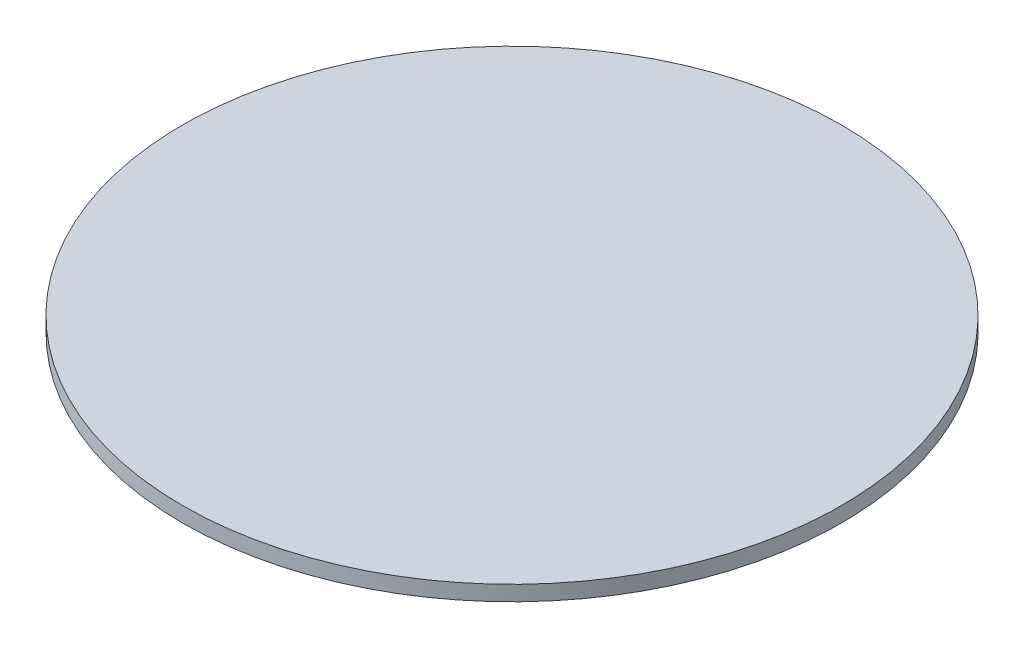
ISO-10303-21;
HEADER;
FILE_DESCRIPTION(('STEP AP214'),'2;1');
FILE_NAME('part.step','',(''),(''),'','','');
FILE_SCHEMA(('AUTOMOTIVE_DESIGN { 1 0 10303 214 1 1 1 1 }'));
ENDSEC;
DATA;
#1=APPLICATION_CONTEXT('core data for automotive mechanical design processes');
#2=APPLICATION_PROTOCOL_DEFINITION('international standard','automotive_design',2000,#1);
#3=PRODUCT_CONTEXT('',#1,'mechanical');
#4=PRODUCT('Part','Part','',(#3));
#5=PRODUCT_RELATED_PRODUCT_CATEGORY('part','',(#4));
#6=PRODUCT_DEFINITION_FORMATION('','',#4);
#7=PRODUCT_DEFINITION_CONTEXT('part definition',#1,'design');
#8=PRODUCT_DEFINITION('design','',#6,#7);
#9=PRODUCT_DEFINITION_SHAPE('','',#8);
#10=(LENGTH_UNIT() NAMED_UNIT(*) SI_UNIT(.MILLI.,.METRE.));
#11=(NAMED_UNIT(*) PLANE_ANGLE_UNIT() SI_UNIT($,.RADIAN.));
#12=(NAMED_UNIT(*) SI_UNIT($,.STERADIAN.) SOLID_ANGLE_UNIT());
#13=UNCERTAINTY_MEASURE_WITH_UNIT(LENGTH_MEASURE(1.E-05),#10,'distance_accuracy_value','');
#14=(GEOMETRIC_REPRESENTATION_CONTEXT(3) GLOBAL_UNCERTAINTY_ASSIGNED_CONTEXT((#13)) GLOBAL_UNIT_ASSIGNED_CONTEXT((#10,
#11,#12)) REPRESENTATION_CONTEXT('',''));
#15=CARTESIAN_POINT('',(0.,0.,0.));
#16=DIRECTION('',(0.,0.,1.));
#17=DIRECTION('',(1.,0.,0.));
#18=AXIS2_PLACEMENT_3D('',#15,#16,#17);
#19=CARTESIAN_POINT('',(0.,-2.3,0.));
#20=DIRECTION('',(0.,1.,0.));
#21=DIRECTION('',(0.,0.,1.));
#22=AXIS2_PLACEMENT_3D('',#19,#20,#21);
#23=CYLINDRICAL_SURFACE('',#22,50.);
#24=CARTESIAN_POINT('',(0.,-2.3,0.));
#25=DIRECTION('',(0.,1.,0.));
#26=DIRECTION('',(0.,0.,1.));
#27=AXIS2_PLACEMENT_3D('',#24,#25,#26);
#28=CIRCLE('',#27,50.);
#29=CARTESIAN_POINT('',(0.,-2.3,50.));
#30=VERTEX_POINT('',#29);
#31=EDGE_CURVE('E11',#30,#30,#28,.T.);
#32=ORIENTED_EDGE('',*,*,#31,.T.);
#33=EDGE_LOOP('',(#32));
#34=FACE_BOUND('',#33,.T.);
#35=CARTESIAN_POINT('',(0.,0.,0.));
#36=DIRECTION('',(0.,1.,0.));
#37=DIRECTION('',(0.,0.,1.));
#38=AXIS2_PLACEMENT_3D('',#35,#36,#37);
#39=CIRCLE('',#38,50.);
#40=CARTESIAN_POINT('',(0.,0.,50.));
#41=VERTEX_POINT('',#40);
#42=EDGE_CURVE('E49',#41,#41,#39,.T.);
#43=ORIENTED_EDGE('',*,*,#42,.F.);
#44=EDGE_LOOP('',(#43));
#45=FACE_BOUND('',#44,.T.);
#46=ADVANCED_FACE('F46',(#34,#45),#23,.T.);
#47=CARTESIAN_POINT('',(0.,-2.3,0.));
#48=DIRECTION('',(0.,1.,0.));
#49=DIRECTION('',(0.,0.,1.));
#50=AXIS2_PLACEMENT_3D('',#47,#48,#49);
#51=PLANE('',#50);
#52=ORIENTED_EDGE('',*,*,#31,.F.);
#53=EDGE_LOOP('',(#52));
#54=FACE_BOUND('',#53,.T.);
#55=ADVANCED_FACE('F61',(#54),#51,.F.);
#56=CARTESIAN_POINT('',(0.,0.,0.));
#57=DIRECTION('',(0.,1.,0.));
#58=DIRECTION('',(0.,0.,1.));
#59=AXIS2_PLACEMENT_3D('',#56,#57,#58);
#60=PLANE('',#59);
#61=ORIENTED_EDGE('',*,*,#42,.T.);
#62=EDGE_LOOP('',(#61));
#63=FACE_BOUND('',#62,.T.);
#64=ADVANCED_FACE('F58',(#63),#60,.T.);
#65=CLOSED_SHELL('',(#46,#55,#64));
#66=MANIFOLD_SOLID_BREP('B2',#65);
#67=CARTESIAN_POINT('',(16.0143097169968,-2.3,-23.6911711029544));
#68=DIRECTION('',(0.,1.,0.));
#69=DIRECTION('',(0.,0.,1.));
#70=AXIS2_PLACEMENT_3D('',#67,#68,#69);
#71=CYLINDRICAL_SURFACE('',#70,12.5);
#72=CARTESIAN_POINT('',(16.0143097169968,-2.3,-23.6911711029544));
#73=DIRECTION('',(0.,1.,0.));
#74=DIRECTION('',(0.,0.,1.));
#75=AXIS2_PLACEMENT_3D('',#72,#73,#74);
#76=CIRCLE('',#75,12.5);
#77=CARTESIAN_POINT('',(16.0143097169968,-2.3,-11.1911711029544));
#78=VERTEX_POINT('',#77);
#79=EDGE_CURVE('E45',#78,#78,#76,.T.);
#80=ORIENTED_EDGE('',*,*,#79,.T.);
#81=EDGE_LOOP('',(#80));
#82=FACE_BOUND('',#81,.T.);
#83=CARTESIAN_POINT('',(16.0143097169968,0.,-23.6911711029544));
#84=DIRECTION('',(0.,1.,0.));
#85=DIRECTION('',(0.,0.,1.));
#86=AXIS2_PLACEMENT_3D('',#83,#84,#85);
#87=CIRCLE('',#86,12.5);
#88=CARTESIAN_POINT('',(16.0143097169968,0.,-11.1911711029544));
#89=VERTEX_POINT('',#88);
#90=EDGE_CURVE('E105',#89,#89,#87,.T.);
#91=ORIENTED_EDGE('',*,*,#90,.F.);
#92=EDGE_LOOP('',(#91));
#93=FACE_BOUND('',#92,.T.);
#94=ADVANCED_FACE('F102',(#82,#93),#71,.T.);
#95=CARTESIAN_POINT('',(16.0143097169968,-2.3,-23.6911711029544));
#96=DIRECTION('',(0.,1.,0.));
#97=DIRECTION('',(0.,0.,1.));
#98=AXIS2_PLACEMENT_3D('',#95,#96,#97);
#99=PLANE('',#98);
#100=CARTESIAN_POINT('',(16.0143097169968,-2.3,-23.6911711029544));
#101=DIRECTION('',(0.,1.,0.));
#102=DIRECTION('',(0.,0.,1.));
#103=AXIS2_PLACEMENT_3D('',#100,#101,#102);
#104=CIRCLE('',#103,1.5);
#105=CARTESIAN_POINT('',(16.0143097169968,-2.3,-22.1911711029544));
#106=VERTEX_POINT('',#105);
#107=EDGE_CURVE('E112',#106,#106,#104,.T.);
#108=ORIENTED_EDGE('',*,*,#107,.T.);
#109=EDGE_LOOP('',(#108));
#110=FACE_BOUND('',#109,.T.);
#111=ORIENTED_EDGE('',*,*,#79,.F.);
#112=EDGE_LOOP('',(#111));
#113=FACE_BOUND('',#112,.T.);
#114=ADVANCED_FACE('F120',(#110,#113),#99,.F.);
#115=CARTESIAN_POINT('',(16.0143097169968,0.,-23.6911711029544));
#116=DIRECTION('',(0.,1.,0.));
#117=DIRECTION('',(0.,0.,1.));
#118=AXIS2_PLACEMENT_3D('',#115,#116,#117);
#119=PLANE('',#118);
#120=CARTESIAN_POINT('',(16.0143097169968,0.,-23.6911711029544));
#121=DIRECTION('',(0.,1.,0.));
#122=DIRECTION('',(0.,0.,1.));
#123=AXIS2_PLACEMENT_3D('',#120,#121,#122);
#124=CIRCLE('',#123,1.5);
#125=CARTESIAN_POINT('',(16.0143097169968,0.,-22.1911711029544));
#126=VERTEX_POINT('',#125);
#127=EDGE_CURVE('E114',#126,#126,#124,.T.);
#128=ORIENTED_EDGE('',*,*,#127,.F.);
#129=EDGE_LOOP('',(#128));
#130=FACE_BOUND('',#129,.T.);
#131=ORIENTED_EDGE('',*,*,#90,.T.);
#132=EDGE_LOOP('',(#131));
#133=FACE_BOUND('',#132,.T.);
#134=ADVANCED_FACE('F126',(#130,#133),#119,.T.);
#135=CARTESIAN_POINT('',(16.0143097169968,-2.3,-23.6911711029544));
#136=DIRECTION('',(0.,1.,0.));
#137=DIRECTION('',(0.,0.,1.));
#138=AXIS2_PLACEMENT_3D('',#135,#136,#137);
#139=CYLINDRICAL_SURFACE('',#138,1.5);
#140=ORIENTED_EDGE('',*,*,#107,.F.);
#141=EDGE_LOOP('',(#140));
#142=FACE_BOUND('',#141,.T.);
#143=ORIENTED_EDGE('',*,*,#127,.T.);
#144=EDGE_LOOP('',(#143));
#145=FACE_BOUND('',#144,.T.);
#146=ADVANCED_FACE('F123',(#142,#145),#139,.F.);
#147=CLOSED_SHELL('',(#94,#114,#134,#146));
#148=MANIFOLD_SOLID_BREP('B6_NOT_SHOWN',#147);
#149=CARTESIAN_POINT('',(0.,-2.3,-13.4454564079125));
#150=DIRECTION('',(-1.,0.,0.));
#151=DIRECTION('',(0.,0.,1.));
#152=AXIS2_PLACEMENT_3D('',#149,#150,#151);
#153=PLANE('',#152);
#154=DIRECTION('',(0.,0.,1.));
#155=VECTOR('',#154,1.);
#156=CARTESIAN_POINT('',(0.,0.,-13.4454564079125));
#157=LINE('',#156,#155);
#158=CARTESIAN_POINT('',(0.,0.,-13.4454564079125));
#159=VERTEX_POINT('',#158);
#160=CARTESIAN_POINT('',(0.,0.,-6.5454564079125));
#161=VERTEX_POINT('',#160);
#162=EDGE_CURVE('E331',#159,#161,#157,.T.);
#163=ORIENTED_EDGE('',*,*,#162,.F.);
#164=DIRECTION('',(0.,1.,0.));
#165=VECTOR('',#164,1.);
#166=CARTESIAN_POINT('',(0.,-2.3,-13.4454564079125));
#167=LINE('',#166,#165);
#168=CARTESIAN_POINT('',(0.,-2.3,-13.4454564079125));
#169=VERTEX_POINT('',#168);
#170=EDGE_CURVE('E100',#169,#159,#167,.T.);
#171=ORIENTED_EDGE('',*,*,#170,.F.);
#172=DIRECTION('',(0.,0.,1.));
#173=VECTOR('',#172,1.);
#174=CARTESIAN_POINT('',(0.,-2.3,-13.4454564079125));
#175=LINE('',#174,#173);
#176=CARTESIAN_POINT('',(0.,-2.3,-6.5454564079125));
#177=VERTEX_POINT('',#176);
#178=EDGE_CURVE('E378',#169,#177,#175,.T.);
#179=ORIENTED_EDGE('',*,*,#178,.T.);
#180=DIRECTION('',(0.,1.,0.));
#181=VECTOR('',#180,1.);
#182=CARTESIAN_POINT('',(0.,-2.3,-6.5454564079125));
#183=LINE('',#182,#181);
#184=EDGE_CURVE('E183',#177,#161,#183,.T.);
#185=ORIENTED_EDGE('',*,*,#184,.T.);
#186=EDGE_LOOP('',(#163,#171,#179,#185));
#187=FACE_BOUND('',#186,.T.);
#188=ADVANCED_FACE('F180',(#187),#153,.T.);
#189=CARTESIAN_POINT('',(0.,-2.3,-13.4454564079125));
#190=DIRECTION('',(0.,0.,-1.));
#191=DIRECTION('',(-1.,0.,0.));
#192=AXIS2_PLACEMENT_3D('',#189,#190,#191);
#193=PLANE('',#192);
#194=DIRECTION('',(-1.,0.,0.));
#195=VECTOR('',#194,1.);
#196=CARTESIAN_POINT('',(0.,0.,-13.4454564079125));
#197=LINE('',#196,#195);
#198=CARTESIAN_POINT('',(2.3,0.,-13.4454564079125));
#199=VERTEX_POINT('',#198);
#200=EDGE_CURVE('E376',#199,#159,#197,.T.);
#201=ORIENTED_EDGE('',*,*,#200,.F.);
#202=DIRECTION('',(0.,1.,0.));
#203=VECTOR('',#202,1.);
#204=CARTESIAN_POINT('',(2.3,-2.3,-13.4454564079125));
#205=LINE('',#204,#203);
#206=CARTESIAN_POINT('',(2.3,-2.3,-13.4454564079125));
#207=VERTEX_POINT('',#206);
#208=EDGE_CURVE('E189',#207,#199,#205,.T.);
#209=ORIENTED_EDGE('',*,*,#208,.F.);
#210=DIRECTION('',(-1.,0.,0.));
#211=VECTOR('',#210,1.);
#212=CARTESIAN_POINT('',(0.,-2.3,-13.4454564079125));
#213=LINE('',#212,#211);
#214=EDGE_CURVE('E321',#207,#169,#213,.T.);
#215=ORIENTED_EDGE('',*,*,#214,.T.);
#216=ORIENTED_EDGE('',*,*,#170,.T.);
#217=EDGE_LOOP('',(#201,#209,#215,#216));
#218=FACE_BOUND('',#217,.T.);
#219=ADVANCED_FACE('F408',(#218),#193,.T.);
#220=CARTESIAN_POINT('',(2.3,-2.3,-13.4454564079125));
#221=DIRECTION('',(1.,0.,0.));
#222=DIRECTION('',(0.,0.,-1.));
#223=AXIS2_PLACEMENT_3D('',#220,#221,#222);
#224=PLANE('',#223);
#225=DIRECTION('',(0.,0.,-1.));
#226=VECTOR('',#225,1.);
#227=CARTESIAN_POINT('',(2.3,0.,-13.4454564079125));
#228=LINE('',#227,#226);
#229=CARTESIAN_POINT('',(2.3,0.,-11.1454564079125));
#230=VERTEX_POINT('',#229);
#231=EDGE_CURVE('E308',#230,#199,#228,.T.);
#232=ORIENTED_EDGE('',*,*,#231,.F.);
#233=DIRECTION('',(0.,1.,0.));
#234=VECTOR('',#233,1.);
#235=CARTESIAN_POINT('',(2.3,-2.3,-11.1454564079125));
#236=LINE('',#235,#234);
#237=CARTESIAN_POINT('',(2.3,-2.3,-11.1454564079125));
#238=VERTEX_POINT('',#237);
#239=EDGE_CURVE('E303',#238,#230,#236,.T.);
#240=ORIENTED_EDGE('',*,*,#239,.F.);
#241=DIRECTION('',(0.,0.,-1.));
#242=VECTOR('',#241,1.);
#243=CARTESIAN_POINT('',(2.3,-2.3,-13.4454564079125));
#244=LINE('',#243,#242);
#245=EDGE_CURVE('E306',#238,#207,#244,.T.);
#246=ORIENTED_EDGE('',*,*,#245,.T.);
#247=ORIENTED_EDGE('',*,*,#208,.T.);
#248=EDGE_LOOP('',(#232,#240,#246,#247));
#249=FACE_BOUND('',#248,.T.);
#250=ADVANCED_FACE('F305',(#249),#224,.T.);
#251=CARTESIAN_POINT('',(2.3,-2.3,-11.1454564079125));
#252=DIRECTION('',(0.,0.,-1.));
#253=DIRECTION('',(-1.,0.,0.));
#254=AXIS2_PLACEMENT_3D('',#251,#252,#253);
#255=PLANE('',#254);
#256=DIRECTION('',(-1.,0.,0.));
#257=VECTOR('',#256,1.);
#258=CARTESIAN_POINT('',(2.3,0.,-11.1454564079125));
#259=LINE('',#258,#257);
#260=CARTESIAN_POINT('',(6.9,0.,-11.1454564079125));
#261=VERTEX_POINT('',#260);
#262=EDGE_CURVE('E373',#261,#230,#259,.T.);
#263=ORIENTED_EDGE('',*,*,#262,.F.);
#264=DIRECTION('',(0.,1.,0.));
#265=VECTOR('',#264,1.);
#266=CARTESIAN_POINT('',(6.9,-2.3,-11.1454564079125));
#267=LINE('',#266,#265);
#268=CARTESIAN_POINT('',(6.9,-2.3,-11.1454564079125));
#269=VERTEX_POINT('',#268);
#270=EDGE_CURVE('E313',#269,#261,#267,.T.);
#271=ORIENTED_EDGE('',*,*,#270,.F.);
#272=DIRECTION('',(-1.,0.,0.));
#273=VECTOR('',#272,1.);
#274=CARTESIAN_POINT('',(2.3,-2.3,-11.1454564079125));
#275=LINE('',#274,#273);
#276=EDGE_CURVE('E319',#269,#238,#275,.T.);
#277=ORIENTED_EDGE('',*,*,#276,.T.);
#278=ORIENTED_EDGE('',*,*,#239,.T.);
#279=EDGE_LOOP('',(#263,#271,#277,#278));
#280=FACE_BOUND('',#279,.T.);
#281=ADVANCED_FACE('F323',(#280),#255,.T.);
#282=CARTESIAN_POINT('',(6.9,-2.3,-11.1454564079125));
#283=DIRECTION('',(-1.,0.,0.));
#284=DIRECTION('',(0.,0.,1.));
#285=AXIS2_PLACEMENT_3D('',#282,#283,#284);
#286=PLANE('',#285);
#287=DIRECTION('',(0.,0.,1.));
#288=VECTOR('',#287,1.);
#289=CARTESIAN_POINT('',(6.9,0.,-11.1454564079125));
#290=LINE('',#289,#288);
#291=CARTESIAN_POINT('',(6.9,0.,-11.3954564079125));
#292=VERTEX_POINT('',#291);
#293=EDGE_CURVE('E370',#292,#261,#290,.T.);
#294=ORIENTED_EDGE('',*,*,#293,.F.);
#295=DIRECTION('',(0.,1.,0.));
#296=VECTOR('',#295,1.);
#297=CARTESIAN_POINT('',(6.9,-2.3,-11.3954564079125));
#298=LINE('',#297,#296);
#299=CARTESIAN_POINT('',(6.9,-2.3,-11.3954564079125));
#300=VERTEX_POINT('',#299);
#301=EDGE_CURVE('E382',#300,#292,#298,.T.);
#302=ORIENTED_EDGE('',*,*,#301,.F.);
#303=DIRECTION('',(0.,0.,1.));
#304=VECTOR('',#303,1.);
#305=CARTESIAN_POINT('',(6.9,-2.3,-11.1454564079125));
#306=LINE('',#305,#304);
#307=EDGE_CURVE('E324',#300,#269,#306,.T.);
#308=ORIENTED_EDGE('',*,*,#307,.T.);
#309=ORIENTED_EDGE('',*,*,#270,.T.);
#310=EDGE_LOOP('',(#294,#302,#308,#309));
#311=FACE_BOUND('',#310,.T.);
#312=ADVANCED_FACE('F421',(#311),#286,.T.);
#313=CARTESIAN_POINT('',(6.9,-2.3,-11.3954564079125));
#314=DIRECTION('',(0.212429644331043,0.,-0.977176363922801));
#315=DIRECTION('',(-0.977176363922801,0.,-0.212429644331043));
#316=AXIS2_PLACEMENT_3D('',#313,#314,#315);
#317=PLANE('',#316);
#318=DIRECTION('',(-0.977176363922801,0.,-0.212429644331043));
#319=VECTOR('',#318,1.);
#320=CARTESIAN_POINT('',(6.9,0.,-11.3954564079125));
#321=LINE('',#320,#319);
#322=CARTESIAN_POINT('',(7.65621482216552,0.,-11.2310618813548));
#323=VERTEX_POINT('',#322);
#324=EDGE_CURVE('E367',#323,#292,#321,.T.);
#325=ORIENTED_EDGE('',*,*,#324,.F.);
#326=DIRECTION('',(0.,1.,0.));
#327=VECTOR('',#326,1.);
#328=CARTESIAN_POINT('',(7.65621482216552,-2.3,-11.2310618813548));
#329=LINE('',#328,#327);
#330=CARTESIAN_POINT('',(7.65621482216552,-2.3,-11.2310618813548));
#331=VERTEX_POINT('',#330);
#332=EDGE_CURVE('E384',#331,#323,#329,.T.);
#333=ORIENTED_EDGE('',*,*,#332,.F.);
#334=DIRECTION('',(-0.977176363922801,0.,-0.212429644331043));
#335=VECTOR('',#334,1.);
#336=CARTESIAN_POINT('',(6.9,-2.3,-11.3954564079125));
#337=LINE('',#336,#335);
#338=EDGE_CURVE('E326',#331,#300,#337,.T.);
#339=ORIENTED_EDGE('',*,*,#338,.T.);
#340=ORIENTED_EDGE('',*,*,#301,.T.);
#341=EDGE_LOOP('',(#325,#333,#339,#340));
#342=FACE_BOUND('',#341,.T.);
#343=ADVANCED_FACE('F424',(#342),#317,.T.);
#344=CARTESIAN_POINT('',(7.55,-2.3,-10.7424736993934));
#345=DIRECTION('',(0.,1.,0.));
#346=DIRECTION('',(0.,0.,1.));
#347=AXIS2_PLACEMENT_3D('',#344,#345,#346);
#348=CYLINDRICAL_SURFACE('',#347,0.5);
#349=CARTESIAN_POINT('',(7.55,0.,-10.7424736993934));
#350=DIRECTION('',(0.,1.,0.));
#351=DIRECTION('',(0.,0.,-1.));
#352=AXIS2_PLACEMENT_3D('',#349,#350,#351);
#353=CIRCLE('',#352,0.5);
#354=CARTESIAN_POINT('',(8.05,0.,-10.7424736993934));
#355=VERTEX_POINT('',#354);
#356=EDGE_CURVE('E364',#355,#323,#353,.T.);
#357=ORIENTED_EDGE('',*,*,#356,.F.);
#358=DIRECTION('',(0.,1.,0.));
#359=VECTOR('',#358,1.);
#360=CARTESIAN_POINT('',(8.05,-2.3,-10.7424736993934));
#361=LINE('',#360,#359);
#362=CARTESIAN_POINT('',(8.05,-2.3,-10.7424736993934));
#363=VERTEX_POINT('',#362);
#364=EDGE_CURVE('E386',#363,#355,#361,.T.);
#365=ORIENTED_EDGE('',*,*,#364,.F.);
#366=CARTESIAN_POINT('',(7.55,-2.3,-10.7424736993934));
#367=DIRECTION('',(0.,1.,0.));
#368=DIRECTION('',(0.,0.,-1.));
#369=AXIS2_PLACEMENT_3D('',#366,#367,#368);
#370=CIRCLE('',#369,0.5);
#371=EDGE_CURVE('E660',#363,#331,#370,.T.);
#372=ORIENTED_EDGE('',*,*,#371,.T.);
#373=ORIENTED_EDGE('',*,*,#332,.T.);
#374=EDGE_LOOP('',(#357,#365,#372,#373));
#375=FACE_BOUND('',#374,.T.);
#376=ADVANCED_FACE('F428',(#375),#348,.T.);
#377=CARTESIAN_POINT('',(8.05,-2.3,-10.7424736993934));
#378=DIRECTION('',(1.,0.,0.));
#379=DIRECTION('',(0.,0.,-1.));
#380=AXIS2_PLACEMENT_3D('',#377,#378,#379);
#381=PLANE('',#380);
#382=DIRECTION('',(0.,0.,-1.));
#383=VECTOR('',#382,1.);
#384=CARTESIAN_POINT('',(8.05,0.,-10.7424736993934));
#385=LINE('',#384,#383);
#386=CARTESIAN_POINT('',(8.05,0.,-10.2454564079125));
#387=VERTEX_POINT('',#386);
#388=EDGE_CURVE('E361',#387,#355,#385,.T.);
#389=ORIENTED_EDGE('',*,*,#388,.F.);
#390=DIRECTION('',(0.,1.,0.));
#391=VECTOR('',#390,1.);
#392=CARTESIAN_POINT('',(8.05,-2.3,-10.2454564079125));
#393=LINE('',#392,#391);
#394=CARTESIAN_POINT('',(8.05,-2.3,-10.2454564079125));
#395=VERTEX_POINT('',#394);
#396=EDGE_CURVE('E388',#395,#387,#393,.T.);
#397=ORIENTED_EDGE('',*,*,#396,.F.);
#398=DIRECTION('',(0.,0.,-1.));
#399=VECTOR('',#398,1.);
#400=CARTESIAN_POINT('',(8.05,-2.3,-10.7424736993934));
#401=LINE('',#400,#399);
#402=EDGE_CURVE('E653',#395,#363,#401,.T.);
#403=ORIENTED_EDGE('',*,*,#402,.T.);
#404=ORIENTED_EDGE('',*,*,#364,.T.);
#405=EDGE_LOOP('',(#389,#397,#403,#404));
#406=FACE_BOUND('',#405,.T.);
#407=ADVANCED_FACE('F432',(#406),#381,.T.);
#408=CARTESIAN_POINT('',(8.05,-2.3,-10.2454564079125));
#409=DIRECTION('',(0.0722742605784705,0.,0.997384795982892));
#410=DIRECTION('',(0.997384795982892,0.,-0.0722742605784705));
#411=AXIS2_PLACEMENT_3D('',#408,#409,#410);
#412=PLANE('',#411);
#413=DIRECTION('',(0.997384795982892,0.,-0.0722742605784705));
#414=VECTOR('',#413,1.);
#415=CARTESIAN_POINT('',(8.05,0.,-10.2454564079125));
#416=LINE('',#415,#414);
#417=CARTESIAN_POINT('',(4.6,0.,-9.9954564079125));
#418=VERTEX_POINT('',#417);
#419=EDGE_CURVE('E358',#418,#387,#416,.T.);
#420=ORIENTED_EDGE('',*,*,#419,.F.);
#421=DIRECTION('',(0.,1.,0.));
#422=VECTOR('',#421,1.);
#423=CARTESIAN_POINT('',(4.6,-2.3,-9.9954564079125));
#424=LINE('',#423,#422);
#425=CARTESIAN_POINT('',(4.6,-2.3,-9.9954564079125));
#426=VERTEX_POINT('',#425);
#427=EDGE_CURVE('E390',#426,#418,#424,.T.);
#428=ORIENTED_EDGE('',*,*,#427,.F.);
#429=DIRECTION('',(0.997384795982892,0.,-0.0722742605784705));
#430=VECTOR('',#429,1.);
#431=CARTESIAN_POINT('',(8.05,-2.3,-10.2454564079125));
#432=LINE('',#431,#430);
#433=EDGE_CURVE('E649',#426,#395,#432,.T.);
#434=ORIENTED_EDGE('',*,*,#433,.T.);
#435=ORIENTED_EDGE('',*,*,#396,.T.);
#436=EDGE_LOOP('',(#420,#428,#434,#435));
#437=FACE_BOUND('',#436,.T.);
#438=ADVANCED_FACE('F436',(#437),#412,.T.);
#439=CARTESIAN_POINT('',(8.05,-2.3,-9.7454564079125));
#440=DIRECTION('',(0.0722742605784705,0.,-0.997384795982892));
#441=DIRECTION('',(-0.997384795982892,0.,-0.0722742605784705));
#442=AXIS2_PLACEMENT_3D('',#439,#440,#441);
#443=PLANE('',#442);
#444=DIRECTION('',(-0.997384795982892,0.,-0.0722742605784705));
#445=VECTOR('',#444,1.);
#446=CARTESIAN_POINT('',(8.05,0.,-9.7454564079125));
#447=LINE('',#446,#445);
#448=CARTESIAN_POINT('',(8.05,0.,-9.7454564079125));
#449=VERTEX_POINT('',#448);
#450=EDGE_CURVE('E355',#449,#418,#447,.T.);
#451=ORIENTED_EDGE('',*,*,#450,.F.);
#452=DIRECTION('',(0.,1.,0.));
#453=VECTOR('',#452,1.);
#454=CARTESIAN_POINT('',(8.05,-2.3,-9.7454564079125));
#455=LINE('',#454,#453);
#456=CARTESIAN_POINT('',(8.05,-2.3,-9.7454564079125));
#457=VERTEX_POINT('',#456);
#458=EDGE_CURVE('E392',#457,#449,#455,.T.);
#459=ORIENTED_EDGE('',*,*,#458,.F.);
#460=DIRECTION('',(-0.997384795982892,0.,-0.0722742605784705));
#461=VECTOR('',#460,1.);
#462=CARTESIAN_POINT('',(8.05,-2.3,-9.7454564079125));
#463=LINE('',#462,#461);
#464=EDGE_CURVE('E665',#457,#426,#463,.T.);
#465=ORIENTED_EDGE('',*,*,#464,.T.);
#466=ORIENTED_EDGE('',*,*,#427,.T.);
#467=EDGE_LOOP('',(#451,#459,#465,#466));
#468=FACE_BOUND('',#467,.T.);
#469=ADVANCED_FACE('F440',(#468),#443,.T.);
#470=CARTESIAN_POINT('',(8.05,-2.3,-9.24843911643162));
#471=DIRECTION('',(1.,0.,0.));
#472=DIRECTION('',(0.,0.,-1.));
#473=AXIS2_PLACEMENT_3D('',#470,#471,#472);
#474=PLANE('',#473);
#475=DIRECTION('',(0.,0.,-1.));
#476=VECTOR('',#475,1.);
#477=CARTESIAN_POINT('',(8.05,0.,-9.24843911643162));
#478=LINE('',#477,#476);
#479=CARTESIAN_POINT('',(8.05,0.,-9.24843911643162));
#480=VERTEX_POINT('',#479);
#481=EDGE_CURVE('E352',#480,#449,#478,.T.);
#482=ORIENTED_EDGE('',*,*,#481,.F.);
#483=DIRECTION('',(0.,1.,0.));
#484=VECTOR('',#483,1.);
#485=CARTESIAN_POINT('',(8.05,-2.3,-9.24843911643162));
#486=LINE('',#485,#484);
#487=CARTESIAN_POINT('',(8.05,-2.3,-9.24843911643162));
#488=VERTEX_POINT('',#487);
#489=EDGE_CURVE('E394',#488,#480,#486,.T.);
#490=ORIENTED_EDGE('',*,*,#489,.F.);
#491=DIRECTION('',(0.,0.,-1.));
#492=VECTOR('',#491,1.);
#493=CARTESIAN_POINT('',(8.05,-2.3,-9.24843911643162));
#494=LINE('',#493,#492);
#495=EDGE_CURVE('E642',#488,#457,#494,.T.);
#496=ORIENTED_EDGE('',*,*,#495,.T.);
#497=ORIENTED_EDGE('',*,*,#458,.T.);
#498=EDGE_LOOP('',(#482,#490,#496,#497));
#499=FACE_BOUND('',#498,.T.);
#500=ADVANCED_FACE('F444',(#499),#474,.T.);
#501=CARTESIAN_POINT('',(7.55,-2.3,-9.24843911643162));
#502=DIRECTION('',(0.,1.,0.));
#503=DIRECTION('',(0.,0.,1.));
#504=AXIS2_PLACEMENT_3D('',#501,#502,#503);
#505=CYLINDRICAL_SURFACE('',#504,0.5);
#506=CARTESIAN_POINT('',(7.55,0.,-9.24843911643162));
#507=DIRECTION('',(0.,1.,0.));
#508=DIRECTION('',(0.,0.,1.));
#509=AXIS2_PLACEMENT_3D('',#506,#507,#508);
#510=CIRCLE('',#509,0.5);
#511=CARTESIAN_POINT('',(7.65621482216552,0.,-8.75985093447022));
#512=VERTEX_POINT('',#511);
#513=EDGE_CURVE('E349',#512,#480,#510,.T.);
#514=ORIENTED_EDGE('',*,*,#513,.F.);
#515=DIRECTION('',(0.,1.,0.));
#516=VECTOR('',#515,1.);
#517=CARTESIAN_POINT('',(7.65621482216552,-2.3,-8.75985093447022));
#518=LINE('',#517,#516);
#519=CARTESIAN_POINT('',(7.65621482216552,-2.3,-8.75985093447022));
#520=VERTEX_POINT('',#519);
#521=EDGE_CURVE('E396',#520,#512,#518,.T.);
#522=ORIENTED_EDGE('',*,*,#521,.F.);
#523=CARTESIAN_POINT('',(7.55,-2.3,-9.24843911643162));
#524=DIRECTION('',(0.,1.,0.));
#525=DIRECTION('',(0.,0.,1.));
#526=AXIS2_PLACEMENT_3D('',#523,#524,#525);
#527=CIRCLE('',#526,0.5);
#528=EDGE_CURVE('E638',#520,#488,#527,.T.);
#529=ORIENTED_EDGE('',*,*,#528,.T.);
#530=ORIENTED_EDGE('',*,*,#489,.T.);
#531=EDGE_LOOP('',(#514,#522,#529,#530));
#532=FACE_BOUND('',#531,.T.);
#533=ADVANCED_FACE('F448',(#532),#505,.T.);
#534=CARTESIAN_POINT('',(6.9,-2.3,-8.5954564079125));
#535=DIRECTION('',(0.212429644331043,0.,0.977176363922801));
#536=DIRECTION('',(0.977176363922801,0.,-0.212429644331043));
#537=AXIS2_PLACEMENT_3D('',#534,#535,#536);
#538=PLANE('',#537);
#539=DIRECTION('',(0.977176363922801,0.,-0.212429644331043));
#540=VECTOR('',#539,1.);
#541=CARTESIAN_POINT('',(6.9,0.,-8.5954564079125));
#542=LINE('',#541,#540);
#543=CARTESIAN_POINT('',(6.9,0.,-8.5954564079125));
#544=VERTEX_POINT('',#543);
#545=EDGE_CURVE('E346',#544,#512,#542,.T.);
#546=ORIENTED_EDGE('',*,*,#545,.F.);
#547=DIRECTION('',(0.,1.,0.));
#548=VECTOR('',#547,1.);
#549=CARTESIAN_POINT('',(6.9,-2.3,-8.5954564079125));
#550=LINE('',#549,#548);
#551=CARTESIAN_POINT('',(6.9,-2.3,-8.5954564079125));
#552=VERTEX_POINT('',#551);
#553=EDGE_CURVE('E398',#552,#544,#550,.T.);
#554=ORIENTED_EDGE('',*,*,#553,.F.);
#555=DIRECTION('',(0.977176363922801,0.,-0.212429644331043));
#556=VECTOR('',#555,1.);
#557=CARTESIAN_POINT('',(6.9,-2.3,-8.5954564079125));
#558=LINE('',#557,#556);
#559=EDGE_CURVE('E669',#552,#520,#558,.T.);
#560=ORIENTED_EDGE('',*,*,#559,.T.);
#561=ORIENTED_EDGE('',*,*,#521,.T.);
#562=EDGE_LOOP('',(#546,#554,#560,#561));
#563=FACE_BOUND('',#562,.T.);
#564=ADVANCED_FACE('F452',(#563),#538,.T.);
#565=CARTESIAN_POINT('',(6.9,-2.3,-8.8454564079125));
#566=DIRECTION('',(-1.,0.,0.));
#567=DIRECTION('',(0.,0.,1.));
#568=AXIS2_PLACEMENT_3D('',#565,#566,#567);
#569=PLANE('',#568);
#570=DIRECTION('',(0.,0.,1.));
#571=VECTOR('',#570,1.);
#572=CARTESIAN_POINT('',(6.9,0.,-8.8454564079125));
#573=LINE('',#572,#571);
#574=CARTESIAN_POINT('',(6.9,0.,-8.8454564079125));
#575=VERTEX_POINT('',#574);
#576=EDGE_CURVE('E343',#575,#544,#573,.T.);
#577=ORIENTED_EDGE('',*,*,#576,.F.);
#578=DIRECTION('',(0.,1.,0.));
#579=VECTOR('',#578,1.);
#580=CARTESIAN_POINT('',(6.9,-2.3,-8.8454564079125));
#581=LINE('',#580,#579);
#582=CARTESIAN_POINT('',(6.9,-2.3,-8.8454564079125));
#583=VERTEX_POINT('',#582);
#584=EDGE_CURVE('E400',#583,#575,#581,.T.);
#585=ORIENTED_EDGE('',*,*,#584,.F.);
#586=DIRECTION('',(0.,0.,1.));
#587=VECTOR('',#586,1.);
#588=CARTESIAN_POINT('',(6.9,-2.3,-8.8454564079125));
#589=LINE('',#588,#587);
#590=EDGE_CURVE('E631',#583,#552,#589,.T.);
#591=ORIENTED_EDGE('',*,*,#590,.T.);
#592=ORIENTED_EDGE('',*,*,#553,.T.);
#593=EDGE_LOOP('',(#577,#585,#591,#592));
#594=FACE_BOUND('',#593,.T.);
#595=ADVANCED_FACE('F456',(#594),#569,.T.);
#596=CARTESIAN_POINT('',(2.3,-2.3,-8.8454564079125));
#597=DIRECTION('',(0.,0.,1.));
#598=DIRECTION('',(1.,0.,0.));
#599=AXIS2_PLACEMENT_3D('',#596,#597,#598);
#600=PLANE('',#599);
#601=DIRECTION('',(1.,0.,0.));
#602=VECTOR('',#601,1.);
#603=CARTESIAN_POINT('',(2.3,0.,-8.8454564079125));
#604=LINE('',#603,#602);
#605=CARTESIAN_POINT('',(2.3,0.,-8.8454564079125));
#606=VERTEX_POINT('',#605);
#607=EDGE_CURVE('E340',#606,#575,#604,.T.);
#608=ORIENTED_EDGE('',*,*,#607,.F.);
#609=DIRECTION('',(0.,1.,0.));
#610=VECTOR('',#609,1.);
#611=CARTESIAN_POINT('',(2.3,-2.3,-8.8454564079125));
#612=LINE('',#611,#610);
#613=CARTESIAN_POINT('',(2.3,-2.3,-8.8454564079125));
#614=VERTEX_POINT('',#613);
#615=EDGE_CURVE('E402',#614,#606,#612,.T.);
#616=ORIENTED_EDGE('',*,*,#615,.F.);
#617=DIRECTION('',(1.,0.,0.));
#618=VECTOR('',#617,1.);
#619=CARTESIAN_POINT('',(2.3,-2.3,-8.8454564079125));
#620=LINE('',#619,#618);
#621=EDGE_CURVE('E627',#614,#583,#620,.T.);
#622=ORIENTED_EDGE('',*,*,#621,.T.);
#623=ORIENTED_EDGE('',*,*,#584,.T.);
#624=EDGE_LOOP('',(#608,#616,#622,#623));
#625=FACE_BOUND('',#624,.T.);
#626=ADVANCED_FACE('F460',(#625),#600,.T.);
#627=CARTESIAN_POINT('',(2.3,-2.3,-6.5454564079125));
#628=DIRECTION('',(1.,0.,0.));
#629=DIRECTION('',(0.,0.,-1.));
#630=AXIS2_PLACEMENT_3D('',#627,#628,#629);
#631=PLANE('',#630);
#632=DIRECTION('',(0.,0.,-1.));
#633=VECTOR('',#632,1.);
#634=CARTESIAN_POINT('',(2.3,0.,-6.5454564079125));
#635=LINE('',#634,#633);
#636=CARTESIAN_POINT('',(2.3,0.,-6.5454564079125));
#637=VERTEX_POINT('',#636);
#638=EDGE_CURVE('E337',#637,#606,#635,.T.);
#639=ORIENTED_EDGE('',*,*,#638,.F.);
#640=DIRECTION('',(0.,1.,0.));
#641=VECTOR('',#640,1.);
#642=CARTESIAN_POINT('',(2.3,-2.3,-6.5454564079125));
#643=LINE('',#642,#641);
#644=CARTESIAN_POINT('',(2.3,-2.3,-6.5454564079125));
#645=VERTEX_POINT('',#644);
#646=EDGE_CURVE('E403',#645,#637,#643,.T.);
#647=ORIENTED_EDGE('',*,*,#646,.F.);
#648=DIRECTION('',(0.,0.,-1.));
#649=VECTOR('',#648,1.);
#650=CARTESIAN_POINT('',(2.3,-2.3,-6.5454564079125));
#651=LINE('',#650,#649);
#652=EDGE_CURVE('E673',#645,#614,#651,.T.);
#653=ORIENTED_EDGE('',*,*,#652,.T.);
#654=ORIENTED_EDGE('',*,*,#615,.T.);
#655=EDGE_LOOP('',(#639,#647,#653,#654));
#656=FACE_BOUND('',#655,.T.);
#657=ADVANCED_FACE('F464',(#656),#631,.T.);
#658=CARTESIAN_POINT('',(0.,-2.3,-6.5454564079125));
#659=DIRECTION('',(0.,0.,1.));
#660=DIRECTION('',(1.,0.,0.));
#661=AXIS2_PLACEMENT_3D('',#658,#659,#660);
#662=PLANE('',#661);
#663=DIRECTION('',(1.,0.,0.));
#664=VECTOR('',#663,1.);
#665=CARTESIAN_POINT('',(0.,0.,-6.5454564079125));
#666=LINE('',#665,#664);
#667=EDGE_CURVE('E334',#161,#637,#666,.T.);
#668=ORIENTED_EDGE('',*,*,#667,.F.);
#669=ORIENTED_EDGE('',*,*,#184,.F.);
#670=DIRECTION('',(1.,0.,0.));
#671=VECTOR('',#670,1.);
#672=CARTESIAN_POINT('',(0.,-2.3,-6.5454564079125));
#673=LINE('',#672,#671);
#674=EDGE_CURVE('E675',#177,#645,#673,.T.);
#675=ORIENTED_EDGE('',*,*,#674,.T.);
#676=ORIENTED_EDGE('',*,*,#646,.T.);
#677=EDGE_LOOP('',(#668,#669,#675,#676));
#678=FACE_BOUND('',#677,.T.);
#679=ADVANCED_FACE('F405',(#678),#662,.T.);
#680=CARTESIAN_POINT('',(7.55,-2.3,-9.24843911643162));
#681=DIRECTION('',(0.,1.,0.));
#682=DIRECTION('',(0.,0.,1.));
#683=AXIS2_PLACEMENT_3D('',#680,#681,#682);
#684=PLANE('',#683);
#685=ORIENTED_EDGE('',*,*,#178,.F.);
#686=ORIENTED_EDGE('',*,*,#214,.F.);
#687=ORIENTED_EDGE('',*,*,#245,.F.);
#688=ORIENTED_EDGE('',*,*,#276,.F.);
#689=ORIENTED_EDGE('',*,*,#307,.F.);
#690=ORIENTED_EDGE('',*,*,#338,.F.);
#691=ORIENTED_EDGE('',*,*,#371,.F.);
#692=ORIENTED_EDGE('',*,*,#402,.F.);
#693=ORIENTED_EDGE('',*,*,#433,.F.);
#694=ORIENTED_EDGE('',*,*,#464,.F.);
#695=ORIENTED_EDGE('',*,*,#495,.F.);
#696=ORIENTED_EDGE('',*,*,#528,.F.);
#697=ORIENTED_EDGE('',*,*,#559,.F.);
#698=ORIENTED_EDGE('',*,*,#590,.F.);
#699=ORIENTED_EDGE('',*,*,#621,.F.);
#700=ORIENTED_EDGE('',*,*,#652,.F.);
#701=ORIENTED_EDGE('',*,*,#674,.F.);
#702=EDGE_LOOP('',(#685,#686,#687,#688,#689,#690,#691,#692,#693,#694,#695,#696,#697,#698,#699,
#700,#701));
#703=FACE_BOUND('',#702,.T.);
#704=ADVANCED_FACE('F317',(#703),#684,.F.);
#705=CARTESIAN_POINT('',(7.55,0.,-9.24843911643162));
#706=DIRECTION('',(0.,1.,0.));
#707=DIRECTION('',(0.,0.,1.));
#708=AXIS2_PLACEMENT_3D('',#705,#706,#707);
#709=PLANE('',#708);
#710=ORIENTED_EDGE('',*,*,#162,.T.);
#711=ORIENTED_EDGE('',*,*,#667,.T.);
#712=ORIENTED_EDGE('',*,*,#638,.T.);
#713=ORIENTED_EDGE('',*,*,#607,.T.);
#714=ORIENTED_EDGE('',*,*,#576,.T.);
#715=ORIENTED_EDGE('',*,*,#545,.T.);
#716=ORIENTED_EDGE('',*,*,#513,.T.);
#717=ORIENTED_EDGE('',*,*,#481,.T.);
#718=ORIENTED_EDGE('',*,*,#450,.T.);
#719=ORIENTED_EDGE('',*,*,#419,.T.);
#720=ORIENTED_EDGE('',*,*,#388,.T.);
#721=ORIENTED_EDGE('',*,*,#356,.T.);
#722=ORIENTED_EDGE('',*,*,#324,.T.);
#723=ORIENTED_EDGE('',*,*,#293,.T.);
#724=ORIENTED_EDGE('',*,*,#262,.T.);
#725=ORIENTED_EDGE('',*,*,#231,.T.);
#726=ORIENTED_EDGE('',*,*,#200,.T.);
#727=EDGE_LOOP('',(#710,#711,#712,#713,#714,#715,#716,#717,#718,#719,#720,#721,#722,#723,#724,
#725,#726));
#728=FACE_BOUND('',#727,.T.);
#729=ADVANCED_FACE('F407',(#728),#709,.T.);
#730=CLOSED_SHELL('',(#188,#219,#250,#281,#312,#343,#376,#407,#438,#469,#500,#533,#564,#595,
#626,#657,#679,#704,#729));
#731=MANIFOLD_SOLID_BREP('B40_NOT_SHOWN',#730);
#732=CARTESIAN_POINT('',(-3.45,-2.3,3.45));
#733=DIRECTION('',(-1.,0.,0.));
#734=DIRECTION('',(0.,0.,1.));
#735=AXIS2_PLACEMENT_3D('',#732,#733,#734);
#736=PLANE('',#735);
#737=DIRECTION('',(0.,0.,1.));
#738=VECTOR('',#737,1.);
#739=CARTESIAN_POINT('',(-3.45,0.,3.45));
#740=LINE('',#739,#738);
#741=CARTESIAN_POINT('',(-3.45,0.,-3.45));
#742=VERTEX_POINT('',#741);
#743=CARTESIAN_POINT('',(-3.45,0.,3.45));
#744=VERTEX_POINT('',#743);
#745=EDGE_CURVE('E777',#742,#744,#740,.T.);
#746=ORIENTED_EDGE('',*,*,#745,.F.);
#747=DIRECTION('',(0.,1.,0.));
#748=VECTOR('',#747,1.);
#749=CARTESIAN_POINT('',(-3.45,-2.3,-3.45));
#750=LINE('',#749,#748);
#751=CARTESIAN_POINT('',(-3.45,-2.3,-3.45));
#752=VERTEX_POINT('',#751);
#753=EDGE_CURVE('E178',#752,#742,#750,.T.);
#754=ORIENTED_EDGE('',*,*,#753,.F.);
#755=DIRECTION('',(0.,0.,1.));
#756=VECTOR('',#755,1.);
#757=CARTESIAN_POINT('',(-3.45,-2.3,3.45));
#758=LINE('',#757,#756);
#759=CARTESIAN_POINT('',(-3.45,-2.3,3.45));
#760=VERTEX_POINT('',#759);
#761=EDGE_CURVE('E781',#752,#760,#758,.T.);
#762=ORIENTED_EDGE('',*,*,#761,.T.);
#763=DIRECTION('',(0.,1.,0.));
#764=VECTOR('',#763,1.);
#765=CARTESIAN_POINT('',(-3.45,-2.3,3.45));
#766=LINE('',#765,#764);
#767=EDGE_CURVE('E682',#760,#744,#766,.T.);
#768=ORIENTED_EDGE('',*,*,#767,.T.);
#769=EDGE_LOOP('',(#746,#754,#762,#768));
#770=FACE_BOUND('',#769,.T.);
#771=ADVANCED_FACE('F679',(#770),#736,.T.);
#772=CARTESIAN_POINT('',(-3.45,-2.3,-3.45));
#773=DIRECTION('',(0.,0.,-1.));
#774=DIRECTION('',(-1.,0.,0.));
#775=AXIS2_PLACEMENT_3D('',#772,#773,#774);
#776=PLANE('',#775);
#777=DIRECTION('',(-1.,0.,0.));
#778=VECTOR('',#777,1.);
#779=CARTESIAN_POINT('',(-3.45,0.,-3.45));
#780=LINE('',#779,#778);
#781=CARTESIAN_POINT('',(26.55,0.,-3.45));
#782=VERTEX_POINT('',#781);
#783=EDGE_CURVE('E785',#782,#742,#780,.T.);
#784=ORIENTED_EDGE('',*,*,#783,.F.);
#785=DIRECTION('',(0.,1.,0.));
#786=VECTOR('',#785,1.);
#787=CARTESIAN_POINT('',(26.55,-2.3,-3.45));
#788=LINE('',#787,#786);
#789=CARTESIAN_POINT('',(26.55,-2.3,-3.45));
#790=VERTEX_POINT('',#789);
#791=EDGE_CURVE('E687',#790,#782,#788,.T.);
#792=ORIENTED_EDGE('',*,*,#791,.F.);
#793=DIRECTION('',(-1.,0.,0.));
#794=VECTOR('',#793,1.);
#795=CARTESIAN_POINT('',(-3.45,-2.3,-3.45));
#796=LINE('',#795,#794);
#797=EDGE_CURVE('E791',#790,#752,#796,.T.);
#798=ORIENTED_EDGE('',*,*,#797,.T.);
#799=ORIENTED_EDGE('',*,*,#753,.T.);
#800=EDGE_LOOP('',(#784,#792,#798,#799));
#801=FACE_BOUND('',#800,.T.);
#802=ADVANCED_FACE('F817',(#801),#776,.T.);
#803=CARTESIAN_POINT('',(26.55,-2.3,3.45));
#804=DIRECTION('',(1.,0.,0.));
#805=DIRECTION('',(0.,0.,-1.));
#806=AXIS2_PLACEMENT_3D('',#803,#804,#805);
#807=PLANE('',#806);
#808=DIRECTION('',(0.,0.,-1.));
#809=VECTOR('',#808,1.);
#810=CARTESIAN_POINT('',(26.55,0.,3.45));
#811=LINE('',#810,#809);
#812=CARTESIAN_POINT('',(26.55,0.,3.45));
#813=VERTEX_POINT('',#812);
#814=EDGE_CURVE('E799',#813,#782,#811,.T.);
#815=ORIENTED_EDGE('',*,*,#814,.F.);
#816=DIRECTION('',(0.,1.,0.));
#817=VECTOR('',#816,1.);
#818=CARTESIAN_POINT('',(26.55,-2.3,3.45));
#819=LINE('',#818,#817);
#820=CARTESIAN_POINT('',(26.55,-2.3,3.45));
#821=VERTEX_POINT('',#820);
#822=EDGE_CURVE('E804',#821,#813,#819,.T.);
#823=ORIENTED_EDGE('',*,*,#822,.F.);
#824=DIRECTION('',(0.,0.,-1.));
#825=VECTOR('',#824,1.);
#826=CARTESIAN_POINT('',(26.55,-2.3,3.45));
#827=LINE('',#826,#825);
#828=EDGE_CURVE('E788',#821,#790,#827,.T.);
#829=ORIENTED_EDGE('',*,*,#828,.T.);
#830=ORIENTED_EDGE('',*,*,#791,.T.);
#831=EDGE_LOOP('',(#815,#823,#829,#830));
#832=FACE_BOUND('',#831,.T.);
#833=ADVANCED_FACE('F821',(#832),#807,.T.);
#834=CARTESIAN_POINT('',(-3.45,-2.3,3.45));
#835=DIRECTION('',(0.,0.,1.));
#836=DIRECTION('',(1.,0.,0.));
#837=AXIS2_PLACEMENT_3D('',#834,#835,#836);
#838=PLANE('',#837);
#839=DIRECTION('',(1.,0.,0.));
#840=VECTOR('',#839,1.);
#841=CARTESIAN_POINT('',(-3.45,0.,3.45));
#842=LINE('',#841,#840);
#843=EDGE_CURVE('E796',#744,#813,#842,.T.);
#844=ORIENTED_EDGE('',*,*,#843,.F.);
#845=ORIENTED_EDGE('',*,*,#767,.F.);
#846=DIRECTION('',(1.,0.,0.));
#847=VECTOR('',#846,1.);
#848=CARTESIAN_POINT('',(-3.45,-2.3,3.45));
#849=LINE('',#848,#847);
#850=EDGE_CURVE('E784',#760,#821,#849,.T.);
#851=ORIENTED_EDGE('',*,*,#850,.T.);
#852=ORIENTED_EDGE('',*,*,#822,.T.);
#853=EDGE_LOOP('',(#844,#845,#851,#852));
#854=FACE_BOUND('',#853,.T.);
#855=ADVANCED_FACE('F812',(#854),#838,.T.);
#856=CARTESIAN_POINT('',(0.,-2.3,0.));
#857=DIRECTION('',(0.,-1.,0.));
#858=DIRECTION('',(0.,0.,-1.));
#859=AXIS2_PLACEMENT_3D('',#856,#857,#858);
#860=PLANE('',#859);
#861=DIRECTION('',(0.,0.,-1.));
#862=VECTOR('',#861,1.);
#863=CARTESIAN_POINT('',(1.15,-2.3,1.15));
#864=LINE('',#863,#862);
#865=CARTESIAN_POINT('',(1.15,-2.3,1.15));
#866=VERTEX_POINT('',#865);
#867=CARTESIAN_POINT('',(1.15,-2.3,-1.15));
#868=VERTEX_POINT('',#867);
#869=EDGE_CURVE('E746',#866,#868,#864,.T.);
#870=ORIENTED_EDGE('',*,*,#869,.T.);
#871=DIRECTION('',(-1.,0.,0.));
#872=VECTOR('',#871,1.);
#873=CARTESIAN_POINT('',(-1.15,-2.3,-1.15));
#874=LINE('',#873,#872);
#875=CARTESIAN_POINT('',(-1.15,-2.3,-1.15));
#876=VERTEX_POINT('',#875);
#877=EDGE_CURVE('E755',#868,#876,#874,.T.);
#878=ORIENTED_EDGE('',*,*,#877,.T.);
#879=DIRECTION('',(0.,0.,1.));
#880=VECTOR('',#879,1.);
#881=CARTESIAN_POINT('',(-1.15,-2.3,1.15));
#882=LINE('',#881,#880);
#883=CARTESIAN_POINT('',(-1.15,-2.3,1.15));
#884=VERTEX_POINT('',#883);
#885=EDGE_CURVE('E695',#876,#884,#882,.T.);
#886=ORIENTED_EDGE('',*,*,#885,.T.);
#887=DIRECTION('',(1.,0.,0.));
#888=VECTOR('',#887,1.);
#889=CARTESIAN_POINT('',(-1.15,-2.3,1.15));
#890=LINE('',#889,#888);
#891=EDGE_CURVE('E752',#884,#866,#890,.T.);
#892=ORIENTED_EDGE('',*,*,#891,.T.);
#893=EDGE_LOOP('',(#870,#878,#886,#892));
#894=FACE_BOUND('',#893,.T.);
#895=ORIENTED_EDGE('',*,*,#761,.F.);
#896=ORIENTED_EDGE('',*,*,#797,.F.);
#897=ORIENTED_EDGE('',*,*,#828,.F.);
#898=ORIENTED_EDGE('',*,*,#850,.F.);
#899=EDGE_LOOP('',(#895,#896,#897,#898));
#900=FACE_BOUND('',#899,.T.);
#901=ADVANCED_FACE('F759',(#894,#900),#860,.T.);
#902=CARTESIAN_POINT('',(0.,0.,0.));
#903=DIRECTION('',(0.,-1.,0.));
#904=DIRECTION('',(0.,0.,-1.));
#905=AXIS2_PLACEMENT_3D('',#902,#903,#904);
#906=PLANE('',#905);
#907=DIRECTION('',(-1.,0.,0.));
#908=VECTOR('',#907,1.);
#909=CARTESIAN_POINT('',(-1.15,0.,-1.15));
#910=LINE('',#909,#908);
#911=CARTESIAN_POINT('',(1.15,0.,-1.15));
#912=VERTEX_POINT('',#911);
#913=CARTESIAN_POINT('',(-1.15,0.,-1.15));
#914=VERTEX_POINT('',#913);
#915=EDGE_CURVE('E771',#912,#914,#910,.T.);
#916=ORIENTED_EDGE('',*,*,#915,.F.);
#917=DIRECTION('',(0.,0.,-1.));
#918=VECTOR('',#917,1.);
#919=CARTESIAN_POINT('',(1.15,0.,1.15));
#920=LINE('',#919,#918);
#921=CARTESIAN_POINT('',(1.15,0.,1.15));
#922=VERTEX_POINT('',#921);
#923=EDGE_CURVE('E703',#922,#912,#920,.T.);
#924=ORIENTED_EDGE('',*,*,#923,.F.);
#925=DIRECTION('',(1.,0.,0.));
#926=VECTOR('',#925,1.);
#927=CARTESIAN_POINT('',(-1.15,0.,1.15));
#928=LINE('',#927,#926);
#929=CARTESIAN_POINT('',(-1.15,0.,1.15));
#930=VERTEX_POINT('',#929);
#931=EDGE_CURVE('E762',#930,#922,#928,.T.);
#932=ORIENTED_EDGE('',*,*,#931,.F.);
#933=DIRECTION('',(0.,0.,1.));
#934=VECTOR('',#933,1.);
#935=CARTESIAN_POINT('',(-1.15,0.,1.15));
#936=LINE('',#935,#934);
#937=EDGE_CURVE('E765',#914,#930,#936,.T.);
#938=ORIENTED_EDGE('',*,*,#937,.F.);
#939=EDGE_LOOP('',(#916,#924,#932,#938));
#940=FACE_BOUND('',#939,.T.);
#941=ORIENTED_EDGE('',*,*,#745,.T.);
#942=ORIENTED_EDGE('',*,*,#843,.T.);
#943=ORIENTED_EDGE('',*,*,#814,.T.);
#944=ORIENTED_EDGE('',*,*,#783,.T.);
#945=EDGE_LOOP('',(#941,#942,#943,#944));
#946=FACE_BOUND('',#945,.T.);
#947=ADVANCED_FACE('F814',(#940,#946),#906,.F.);
#948=CARTESIAN_POINT('',(1.15,-2.3,1.15));
#949=DIRECTION('',(1.,0.,0.));
#950=DIRECTION('',(0.,0.,-1.));
#951=AXIS2_PLACEMENT_3D('',#948,#949,#950);
#952=PLANE('',#951);
#953=ORIENTED_EDGE('',*,*,#923,.T.);
#954=DIRECTION('',(0.,1.,0.));
#955=VECTOR('',#954,1.);
#956=CARTESIAN_POINT('',(1.15,-2.3,-1.15));
#957=LINE('',#956,#955);
#958=EDGE_CURVE('E742',#868,#912,#957,.T.);
#959=ORIENTED_EDGE('',*,*,#958,.F.);
#960=ORIENTED_EDGE('',*,*,#869,.F.);
#961=DIRECTION('',(0.,1.,0.));
#962=VECTOR('',#961,1.);
#963=CARTESIAN_POINT('',(1.15,-2.3,1.15));
#964=LINE('',#963,#962);
#965=EDGE_CURVE('E775',#866,#922,#964,.T.);
#966=ORIENTED_EDGE('',*,*,#965,.T.);
#967=EDGE_LOOP('',(#953,#959,#960,#966));
#968=FACE_BOUND('',#967,.T.);
#969=ADVANCED_FACE('F744',(#968),#952,.F.);
#970=CARTESIAN_POINT('',(-1.15,-2.3,1.15));
#971=DIRECTION('',(0.,0.,1.));
#972=DIRECTION('',(1.,0.,0.));
#973=AXIS2_PLACEMENT_3D('',#970,#971,#972);
#974=PLANE('',#973);
#975=ORIENTED_EDGE('',*,*,#931,.T.);
#976=ORIENTED_EDGE('',*,*,#965,.F.);
#977=ORIENTED_EDGE('',*,*,#891,.F.);
#978=DIRECTION('',(0.,1.,0.));
#979=VECTOR('',#978,1.);
#980=CARTESIAN_POINT('',(-1.15,-2.3,1.15));
#981=LINE('',#980,#979);
#982=EDGE_CURVE('E778',#884,#930,#981,.T.);
#983=ORIENTED_EDGE('',*,*,#982,.T.);
#984=EDGE_LOOP('',(#975,#976,#977,#983));
#985=FACE_BOUND('',#984,.T.);
#986=ADVANCED_FACE('F877',(#985),#974,.F.);
#987=CARTESIAN_POINT('',(-1.15,-2.3,1.15));
#988=DIRECTION('',(-1.,0.,0.));
#989=DIRECTION('',(0.,0.,1.));
#990=AXIS2_PLACEMENT_3D('',#987,#988,#989);
#991=PLANE('',#990);
#992=ORIENTED_EDGE('',*,*,#937,.T.);
#993=ORIENTED_EDGE('',*,*,#982,.F.);
#994=ORIENTED_EDGE('',*,*,#885,.F.);
#995=DIRECTION('',(0.,1.,0.));
#996=VECTOR('',#995,1.);
#997=CARTESIAN_POINT('',(-1.15,-2.3,-1.15));
#998=LINE('',#997,#996);
#999=EDGE_CURVE('E751',#876,#914,#998,.T.);
#1000=ORIENTED_EDGE('',*,*,#999,.T.);
#1001=EDGE_LOOP('',(#992,#993,#994,#1000));
#1002=FACE_BOUND('',#1001,.T.);
#1003=ADVANCED_FACE('F887',(#1002),#991,.F.);
#1004=CARTESIAN_POINT('',(-1.15,-2.3,-1.15));
#1005=DIRECTION('',(0.,0.,-1.));
#1006=DIRECTION('',(-1.,0.,0.));
#1007=AXIS2_PLACEMENT_3D('',#1004,#1005,#1006);
#1008=PLANE('',#1007);
#1009=ORIENTED_EDGE('',*,*,#915,.T.);
#1010=ORIENTED_EDGE('',*,*,#999,.F.);
#1011=ORIENTED_EDGE('',*,*,#877,.F.);
#1012=ORIENTED_EDGE('',*,*,#958,.T.);
#1013=EDGE_LOOP('',(#1009,#1010,#1011,#1012));
#1014=FACE_BOUND('',#1013,.T.);
#1015=ADVANCED_FACE('F756',(#1014),#1008,.F.);
#1016=CLOSED_SHELL('',(#771,#802,#833,#855,#901,#947,#969,#986,#1003,#1015));
#1017=MANIFOLD_SOLID_BREP('B94_NOT_SHOWN',#1016);
#1018=ADVANCED_BREP_SHAPE_REPRESENTATION('',(#18,#66,#148,#731,#1017),#14);
#1019=SHAPE_DEFINITION_REPRESENTATION(#9,#1018);
ENDSEC;
END-ISO-10303-21;
